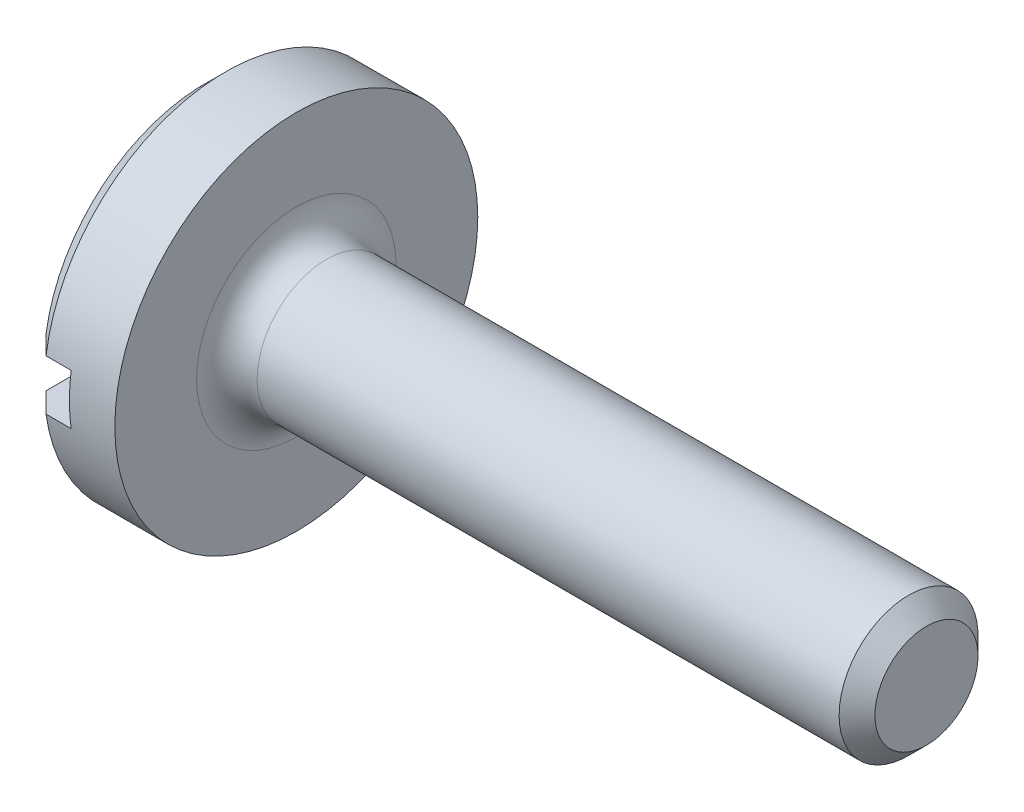
ISO-10303-21;
HEADER;
FILE_DESCRIPTION(('STEP AP214'),'2;1');
FILE_NAME('part.step','',(''),(''),'','','');
FILE_SCHEMA(('AUTOMOTIVE_DESIGN { 1 0 10303 214 1 1 1 1 }'));
ENDSEC;
DATA;
#1=APPLICATION_CONTEXT('core data for automotive mechanical design processes');
#2=APPLICATION_PROTOCOL_DEFINITION('international standard','automotive_design',2000,#1);
#3=PRODUCT_CONTEXT('',#1,'mechanical');
#4=PRODUCT('Part','Part','',(#3));
#5=PRODUCT_RELATED_PRODUCT_CATEGORY('part','',(#4));
#6=PRODUCT_DEFINITION_FORMATION('','',#4);
#7=PRODUCT_DEFINITION_CONTEXT('part definition',#1,'design');
#8=PRODUCT_DEFINITION('design','',#6,#7);
#9=PRODUCT_DEFINITION_SHAPE('','',#8);
#10=(LENGTH_UNIT() NAMED_UNIT(*) SI_UNIT(.MILLI.,.METRE.));
#11=(NAMED_UNIT(*) PLANE_ANGLE_UNIT() SI_UNIT($,.RADIAN.));
#12=(NAMED_UNIT(*) SI_UNIT($,.STERADIAN.) SOLID_ANGLE_UNIT());
#13=UNCERTAINTY_MEASURE_WITH_UNIT(LENGTH_MEASURE(1.E-05),#10,'distance_accuracy_value','');
#14=(GEOMETRIC_REPRESENTATION_CONTEXT(3) GLOBAL_UNCERTAINTY_ASSIGNED_CONTEXT((#13)) GLOBAL_UNIT_ASSIGNED_CONTEXT((#10,
#11,#12)) REPRESENTATION_CONTEXT('',''));
#15=CARTESIAN_POINT('',(0.,0.,0.));
#16=DIRECTION('',(0.,0.,1.));
#17=DIRECTION('',(1.,0.,0.));
#18=AXIS2_PLACEMENT_3D('',#15,#16,#17);
#19=CARTESIAN_POINT('',(-25.4,0.,0.));
#20=DIRECTION('',(-1.,0.,0.));
#21=DIRECTION('',(0.,0.,1.));
#22=AXIS2_PLACEMENT_3D('',#19,#20,#21);
#23=CYLINDRICAL_SURFACE('',#22,1.8288);
#24=CARTESIAN_POINT('',(0.914399999999999,0.,0.));
#25=DIRECTION('',(-1.,0.,0.));
#26=DIRECTION('',(0.,0.,1.));
#27=AXIS2_PLACEMENT_3D('',#24,#25,#26);
#28=CIRCLE('',#27,1.8288);
#29=CARTESIAN_POINT('',(0.914399999999999,0.,1.8288));
#30=VERTEX_POINT('',#29);
#31=EDGE_CURVE('E146',#30,#30,#28,.T.);
#32=ORIENTED_EDGE('',*,*,#31,.T.);
#33=EDGE_LOOP('',(#32));
#34=FACE_BOUND('',#33,.T.);
#35=CARTESIAN_POINT('',(0.203200000000001,0.,0.));
#36=DIRECTION('',(-1.,0.,0.));
#37=DIRECTION('',(0.,0.,1.));
#38=AXIS2_PLACEMENT_3D('',#35,#36,#37);
#39=CIRCLE('',#38,1.8288);
#40=CARTESIAN_POINT('',(0.20320000000003,-0.254,-1.81107521654959));
#41=VERTEX_POINT('',#40);
#42=CARTESIAN_POINT('',(0.203200000000001,-0.254,1.81107521654955));
#43=VERTEX_POINT('',#42);
#44=EDGE_CURVE('E147',#41,#43,#39,.T.);
#45=ORIENTED_EDGE('',*,*,#44,.F.);
#46=DIRECTION('',(-1.,0.,0.));
#47=VECTOR('',#46,1.);
#48=CARTESIAN_POINT('',(-25.4,-0.254,-1.81107521654955));
#49=LINE('',#48,#47);
#50=CARTESIAN_POINT('',(0.457200000000001,-0.254,-1.81107521654955));
#51=VERTEX_POINT('',#50);
#52=EDGE_CURVE('E55',#41,#51,#49,.F.);
#53=ORIENTED_EDGE('',*,*,#52,.T.);
#54=CARTESIAN_POINT('',(0.457200000000001,0.,0.));
#55=DIRECTION('',(-1.,0.,0.));
#56=DIRECTION('',(0.,0.,1.));
#57=AXIS2_PLACEMENT_3D('',#54,#55,#56);
#58=CIRCLE('',#57,1.8288);
#59=CARTESIAN_POINT('',(0.457200000000001,0.254,-1.81107521654955));
#60=VERTEX_POINT('',#59);
#61=EDGE_CURVE('E96',#51,#60,#58,.F.);
#62=ORIENTED_EDGE('',*,*,#61,.T.);
#63=DIRECTION('',(-1.,0.,0.));
#64=VECTOR('',#63,1.);
#65=CARTESIAN_POINT('',(-25.4,0.254,-1.81107521654955));
#66=LINE('',#65,#64);
#67=CARTESIAN_POINT('',(0.203200000000001,0.254,-1.81107521654955));
#68=VERTEX_POINT('',#67);
#69=EDGE_CURVE('E102',#60,#68,#66,.T.);
#70=ORIENTED_EDGE('',*,*,#69,.T.);
#71=CARTESIAN_POINT('',(0.20320000000003,0.254,1.81107521654959));
#72=VERTEX_POINT('',#71);
#73=EDGE_CURVE('E107',#72,#68,#39,.T.);
#74=ORIENTED_EDGE('',*,*,#73,.F.);
#75=DIRECTION('',(-1.,0.,0.));
#76=VECTOR('',#75,1.);
#77=CARTESIAN_POINT('',(-25.4,0.254,1.81107521654955));
#78=LINE('',#77,#76);
#79=CARTESIAN_POINT('',(0.457200000000001,0.254,1.81107521654955));
#80=VERTEX_POINT('',#79);
#81=EDGE_CURVE('E100',#72,#80,#78,.F.);
#82=ORIENTED_EDGE('',*,*,#81,.T.);
#83=CARTESIAN_POINT('',(0.457200000000001,-0.254,1.81107521654955));
#84=VERTEX_POINT('',#83);
#85=EDGE_CURVE('E86',#80,#84,#58,.F.);
#86=ORIENTED_EDGE('',*,*,#85,.T.);
#87=DIRECTION('',(-1.,0.,0.));
#88=VECTOR('',#87,1.);
#89=CARTESIAN_POINT('',(-25.4,-0.254,1.81107521654955));
#90=LINE('',#89,#88);
#91=EDGE_CURVE('E110',#84,#43,#90,.T.);
#92=ORIENTED_EDGE('',*,*,#91,.T.);
#93=EDGE_LOOP('',(#45,#53,#62,#70,#74,#82,#86,#92));
#94=FACE_BOUND('',#93,.T.);
#95=ADVANCED_FACE('F32',(#34,#94),#23,.T.);
#96=CARTESIAN_POINT('',(0.203200000000001,0.,0.));
#97=DIRECTION('',(1.,0.,0.));
#98=DIRECTION('',(0.,0.,-1.));
#99=AXIS2_PLACEMENT_3D('',#96,#97,#98);
#100=CONICAL_SURFACE('',#99,1.8288,0.785398163397453);
#101=CARTESIAN_POINT('',(2.40134405752285,-0.254,-4.01892553332588));
#102=CARTESIAN_POINT('',(2.26411243272227,-0.254,-3.88141790358882));
#103=CARTESIAN_POINT('',(2.12689277691977,-0.254,-3.74389831827494));
#104=CARTESIAN_POINT('',(1.85249047138508,-0.254,-3.46881754407069));
#105=CARTESIAN_POINT('',(1.71530782232552,-0.254,-3.33125635450939));
#106=CARTESIAN_POINT('',(1.44094420691617,-0.254,-3.05602612761354));
#107=CARTESIAN_POINT('',(1.303763261767,-0.254,-2.91835706914425));
#108=CARTESIAN_POINT('',(1.02948630576987,-0.254,-2.64293891043061));
#109=CARTESIAN_POINT('',(0.892390293544645,-0.254,-2.50518981155832));
#110=CARTESIAN_POINT('',(0.615134813964179,-0.254,-2.22634278737173));
#111=CARTESIAN_POINT('',(0.474978507385895,-0.254,-2.08524171972192));
#112=CARTESIAN_POINT('',(0.194901514559455,-0.254,-1.80279178606399));
#113=CARTESIAN_POINT('',(0.0549808402315515,-0.254,-1.66144290821658));
#114=CARTESIAN_POINT('',(-0.154496118844851,-0.254,-1.44905542487529));
#115=CARTESIAN_POINT('',(-0.22424585626257,-0.254,-1.37820765889293));
#116=CARTESIAN_POINT('',(-0.363542084541777,-0.254,-1.23630946617558));
#117=CARTESIAN_POINT('',(-0.433088571386075,-0.254,-1.16525903548911));
#118=CARTESIAN_POINT('',(-0.571828696059754,-0.254,-1.02282736930947));
#119=CARTESIAN_POINT('',(-0.641022365436821,-0.254,-0.951446164522407));
#120=CARTESIAN_POINT('',(-0.778783294995206,-0.254,-0.808082530297724));
#121=CARTESIAN_POINT('',(-0.847350581874042,-0.254,-0.736100126736938));
#122=CARTESIAN_POINT('',(-0.933516362099149,-0.254,-0.643824504174103));
#123=CARTESIAN_POINT('',(-0.951783104651057,-0.254,-0.624157019572037));
#124=CARTESIAN_POINT('',(-0.988170159206146,-0.254,-0.584687057869256));
#125=CARTESIAN_POINT('',(-1.00629046877054,-0.254,-0.56488457853034));
#126=CARTESIAN_POINT('',(-1.0603112755797,-0.254,-0.505296364236475));
#127=CARTESIAN_POINT('',(-1.09593883863702,-0.254,-0.465258446034815));
#128=CARTESIAN_POINT('',(-1.15457051293936,-0.254,-0.396927800211473));
#129=CARTESIAN_POINT('',(-1.17796824170313,-0.254,-0.368973254848941));
#130=CARTESIAN_POINT('',(-1.22365520952044,-0.254,-0.311993963952343));
#131=CARTESIAN_POINT('',(-1.24594060473571,-0.254,-0.282966039691323));
#132=CARTESIAN_POINT('',(-1.2848511746098,-0.254,-0.227850758463363));
#133=CARTESIAN_POINT('',(-1.30181803716944,-0.254,-0.20200616970696));
#134=CARTESIAN_POINT('',(-1.33229183899677,-0.254,-0.148331098872291));
#135=CARTESIAN_POINT('',(-1.34581753171551,-0.254,-0.120512485658227));
#136=CARTESIAN_POINT('',(-1.36086272842291,-0.254,-0.0759914441135061));
#137=CARTESIAN_POINT('',(-1.36503616799142,-0.254,-0.0602332670494036));
#138=CARTESIAN_POINT('',(-1.37051425854224,-0.254,-0.0282568335656514));
#139=CARTESIAN_POINT('',(-1.37183026519961,-0.254,-0.0120406587047759));
#140=CARTESIAN_POINT('',(-1.37130128833427,-0.254,0.020380248607248));
#141=CARTESIAN_POINT('',(-1.36944767179068,-0.254,0.0365848291615389));
#142=CARTESIAN_POINT('',(-1.36300429922283,-0.254,0.0684653426936683));
#143=CARTESIAN_POINT('',(-1.35840438631305,-0.254,0.0841390838798113));
#144=CARTESIAN_POINT('',(-1.34646501947902,-0.254,0.11690192886208));
#145=CARTESIAN_POINT('',(-1.33883071571793,-0.254,0.13387893617182));
#146=CARTESIAN_POINT('',(-1.32194163595541,-0.254,0.167021065627905));
#147=CARTESIAN_POINT('',(-1.31268339831085,-0.254,0.183184356543928));
#148=CARTESIAN_POINT('',(-1.29305944231903,-0.254,0.215000213341224));
#149=CARTESIAN_POINT('',(-1.28268509934841,-0.254,0.230647369139707));
#150=CARTESIAN_POINT('',(-1.26125731478647,-0.254,0.26143930714245));
#151=CARTESIAN_POINT('',(-1.25020459164877,-0.254,0.276584595541761));
#152=CARTESIAN_POINT('',(-1.21381853076418,-0.254,0.324861308288413));
#153=CARTESIAN_POINT('',(-1.18757520869,-0.254,0.357301673386364));
#154=CARTESIAN_POINT('',(-1.13398609835003,-0.254,0.421263730739061));
#155=CARTESIAN_POINT('',(-1.10663971527616,-0.254,0.452784911118691));
#156=CARTESIAN_POINT('',(-1.05126968718847,-0.254,0.51531649489643));
#157=CARTESIAN_POINT('',(-1.02324503054121,-0.254,0.546326002408838));
#158=CARTESIAN_POINT('',(-0.966812178882557,-0.254,0.607977744293632));
#159=CARTESIAN_POINT('',(-0.938404079735878,-0.254,0.638620066977673));
#160=CARTESIAN_POINT('',(-0.853090166985993,-0.254,0.72988285223681));
#161=CARTESIAN_POINT('',(-0.795810543893227,-0.254,0.790153391373873));
#162=CARTESIAN_POINT('',(-0.680808151853422,-0.254,0.910162705667788));
#163=CARTESIAN_POINT('',(-0.623085829918423,-0.254,0.969901911974569));
#164=CARTESIAN_POINT('',(-0.443292149005697,-0.254,1.15510727368889));
#165=CARTESIAN_POINT('',(-0.320740378684249,-0.254,1.28010671404794));
#166=CARTESIAN_POINT('',(-0.0751604759332185,-0.254,1.52963868537837));
#167=CARTESIAN_POINT('',(0.0478676650915984,-0.254,1.65417120784451));
#168=CARTESIAN_POINT('',(0.294233743694415,-0.254,1.90303992156951));
#169=CARTESIAN_POINT('',(0.417571795131782,-0.254,2.02737600024342));
#170=CARTESIAN_POINT('',(0.664390076550216,-0.254,2.27590505103912));
#171=CARTESIAN_POINT('',(0.787870305533691,-0.254,2.40009802415292));
#172=CARTESIAN_POINT('',(1.15954500163206,-0.254,2.77365393576745));
#173=CARTESIAN_POINT('',(1.40787267384457,-0.254000000000001,3.02288435122639));
#174=CARTESIAN_POINT('',(1.78042320401371,-0.254000000000001,3.39655135583526));
#175=CARTESIAN_POINT('',(1.90458661719065,-0.254000000000001,3.52104726889028));
#176=CARTESIAN_POINT('',(2.15294426029162,-0.254000000000001,3.77000773292231));
#177=CARTESIAN_POINT('',(2.27713849013786,-0.254000000000001,3.89447228397693));
#178=CARTESIAN_POINT('',(2.40134405752285,-0.254000000000001,4.01892553332588));
#179=B_SPLINE_CURVE_WITH_KNOTS('',3,(#101,#102,#103,#104,#105,#106,#107,#108,#109,#110,#111,
#112,#113,#114,#115,#116,#117,#118,#119,#120,#121,#122,#123,#124,#125,#126,#127,#128,#129,#130,
#131,#132,#133,#134,#135,#136,#137,#138,#139,#140,#141,#142,#143,#144,#145,#146,#147,#148,#149,
#150,#151,#152,#153,#154,#155,#156,#157,#158,#159,#160,#161,#162,#163,#164,#165,#166,#167,#168,
#169,#170,#171,#172,#173,#174,#175,#176,#177,#178),.UNSPECIFIED.,.F.,.F.,(4,2,2,2,2,2,2,2,2,2,2,
2,2,2,2,2,2,2,2,2,2,2,2,2,2,2,2,2,2,2,2,2,2,2,2,2,2,2,4),(0.,0.58281027527497,1.16563051233696,
1.74867632085366,2.33171241342823,2.92835272249034,3.52502235865943,3.82328364920685,
4.12155079546634,4.41979078684131,4.71801800683685,4.79854261597235,4.87906856346162,
5.03982632551315,5.1491791522158,5.25888686445592,5.35156888904403,5.44373444598671,
5.49243715213885,5.54094595272456,5.58958708602226,5.63840923755168,5.69411617300797,
5.7499433316352,5.80623797536793,5.8624739947275,5.98758936383189,6.1127731257549,
6.23815676171011,6.3635096106225,6.61294438570957,6.86215385501982,7.38730971657339,
7.91247509817027,8.43787512998004,8.96327149750594,10.0187530601156,10.5462396255113,
11.0737248727092),.UNSPECIFIED.);
#180=CARTESIAN_POINT('',(0.,-0.254,-1.60563363193475));
#181=VERTEX_POINT('',#180);
#182=EDGE_CURVE('E112',#41,#181,#179,.T.);
#183=ORIENTED_EDGE('',*,*,#182,.F.);
#184=ORIENTED_EDGE('',*,*,#44,.T.);
#185=CARTESIAN_POINT('',(0.,-0.254,1.60563363193475));
#186=VERTEX_POINT('',#185);
#187=EDGE_CURVE('E108',#186,#43,#179,.T.);
#188=ORIENTED_EDGE('',*,*,#187,.F.);
#189=CARTESIAN_POINT('',(0.,0.,0.));
#190=DIRECTION('',(-1.,0.,0.));
#191=DIRECTION('',(0.,0.,1.));
#192=AXIS2_PLACEMENT_3D('',#189,#190,#191);
#193=CIRCLE('',#192,1.6256);
#194=EDGE_CURVE('E197',#181,#186,#193,.T.);
#195=ORIENTED_EDGE('',*,*,#194,.F.);
#196=EDGE_LOOP('',(#183,#184,#188,#195));
#197=FACE_BOUND('',#196,.T.);
#198=ADVANCED_FACE('F123',(#197),#100,.T.);
#199=CARTESIAN_POINT('',(2.40134405752285,0.254,4.01892553332588));
#200=CARTESIAN_POINT('',(2.26411243272227,0.254,3.88141790358882));
#201=CARTESIAN_POINT('',(2.12689277691977,0.254,3.74389831827494));
#202=CARTESIAN_POINT('',(1.85249047138508,0.254,3.46881754407069));
#203=CARTESIAN_POINT('',(1.71530782232552,0.254,3.33125635450939));
#204=CARTESIAN_POINT('',(1.44094420691617,0.254,3.05602612761354));
#205=CARTESIAN_POINT('',(1.303763261767,0.254,2.91835706914425));
#206=CARTESIAN_POINT('',(1.02948630576987,0.254,2.64293891043062));
#207=CARTESIAN_POINT('',(0.892390293544648,0.254,2.50518981155833));
#208=CARTESIAN_POINT('',(0.615134813964182,0.254,2.22634278737174));
#209=CARTESIAN_POINT('',(0.474978507385898,0.254,2.08524171972192));
#210=CARTESIAN_POINT('',(0.194901514559457,0.254,1.802791786064));
#211=CARTESIAN_POINT('',(0.0549808402315534,0.254,1.66144290821658));
#212=CARTESIAN_POINT('',(-0.154496118844849,0.254,1.44905542487529));
#213=CARTESIAN_POINT('',(-0.224245856262568,0.254,1.37820765889293));
#214=CARTESIAN_POINT('',(-0.363542084541775,0.254,1.23630946617558));
#215=CARTESIAN_POINT('',(-0.433088571386074,0.254,1.16525903548911));
#216=CARTESIAN_POINT('',(-0.571828696059752,0.254,1.02282736930947));
#217=CARTESIAN_POINT('',(-0.641022365436819,0.254,0.951446164522408));
#218=CARTESIAN_POINT('',(-0.778783294995205,0.254,0.808082530297725));
#219=CARTESIAN_POINT('',(-0.847350581874042,0.254,0.73610012673694));
#220=CARTESIAN_POINT('',(-0.933516362099149,0.254,0.643824504174104));
#221=CARTESIAN_POINT('',(-0.951783104651056,0.254,0.624157019572038));
#222=CARTESIAN_POINT('',(-0.988170159206145,0.254,0.584687057869257));
#223=CARTESIAN_POINT('',(-1.00629046877054,0.254,0.564884578530342));
#224=CARTESIAN_POINT('',(-1.0603112755797,0.254,0.505296364236476));
#225=CARTESIAN_POINT('',(-1.09593883863702,0.254,0.465258446034816));
#226=CARTESIAN_POINT('',(-1.15457051293936,0.254,0.396927800211474));
#227=CARTESIAN_POINT('',(-1.17796824170313,0.254,0.368973254848942));
#228=CARTESIAN_POINT('',(-1.22365520952044,0.254,0.311993963952344));
#229=CARTESIAN_POINT('',(-1.24594060473571,0.254,0.282966039691324));
#230=CARTESIAN_POINT('',(-1.2848511746098,0.254,0.227850758463364));
#231=CARTESIAN_POINT('',(-1.30181803716944,0.254,0.202006169706961));
#232=CARTESIAN_POINT('',(-1.33229183899677,0.254,0.148331098872291));
#233=CARTESIAN_POINT('',(-1.34581753171551,0.254,0.120512485658227));
#234=CARTESIAN_POINT('',(-1.36086272842291,0.254,0.0759914441135048));
#235=CARTESIAN_POINT('',(-1.36503616799142,0.254,0.0602332670494021));
#236=CARTESIAN_POINT('',(-1.37051425854224,0.254,0.0282568335656497));
#237=CARTESIAN_POINT('',(-1.37183026519961,0.254,0.0120406587047744));
#238=CARTESIAN_POINT('',(-1.37130128833427,0.254,-0.0203802486072495));
#239=CARTESIAN_POINT('',(-1.36944767179068,0.254,-0.0365848291615405));
#240=CARTESIAN_POINT('',(-1.36300429922283,0.254,-0.0684653426936699));
#241=CARTESIAN_POINT('',(-1.35840438631305,0.254,-0.084139083879813));
#242=CARTESIAN_POINT('',(-1.34646501947902,0.254,-0.116901928862082));
#243=CARTESIAN_POINT('',(-1.33883071571793,0.254,-0.133878936171822));
#244=CARTESIAN_POINT('',(-1.32194163595541,0.254,-0.167021065627908));
#245=CARTESIAN_POINT('',(-1.31268339831085,0.254,-0.183184356543931));
#246=CARTESIAN_POINT('',(-1.29305944231903,0.254,-0.215000213341228));
#247=CARTESIAN_POINT('',(-1.2826850993484,0.254,-0.230647369139711));
#248=CARTESIAN_POINT('',(-1.26125731478647,0.254,-0.261439307142454));
#249=CARTESIAN_POINT('',(-1.25020459164876,0.254,-0.276584595541766));
#250=CARTESIAN_POINT('',(-1.21381853076418,0.254,-0.324861308288419));
#251=CARTESIAN_POINT('',(-1.18757520868999,0.254,-0.35730167338637));
#252=CARTESIAN_POINT('',(-1.13398609835003,0.254,-0.421263730739069));
#253=CARTESIAN_POINT('',(-1.10663971527615,0.254,-0.452784911118699));
#254=CARTESIAN_POINT('',(-1.05126968718847,0.254,-0.51531649489644));
#255=CARTESIAN_POINT('',(-1.0232450305412,0.254,-0.546326002408848));
#256=CARTESIAN_POINT('',(-0.966812178882546,0.254,-0.607977744293644));
#257=CARTESIAN_POINT('',(-0.938404079735866,0.254,-0.638620066977685));
#258=CARTESIAN_POINT('',(-0.853090166985979,0.254,-0.729882852236825));
#259=CARTESIAN_POINT('',(-0.795810543893212,0.254,-0.790153391373889));
#260=CARTESIAN_POINT('',(-0.680808151853404,0.254,-0.910162705667807));
#261=CARTESIAN_POINT('',(-0.623085829918403,0.254,-0.96990191197459));
#262=CARTESIAN_POINT('',(-0.443292149005677,0.254,-1.15510727368891));
#263=CARTESIAN_POINT('',(-0.32074037868423,0.254,-1.28010671404796));
#264=CARTESIAN_POINT('',(-0.0751604759332015,0.254,-1.52963868537839));
#265=CARTESIAN_POINT('',(0.0478676650916143,0.254,-1.65417120784453));
#266=CARTESIAN_POINT('',(0.294233743694429,0.254,-1.90303992156952));
#267=CARTESIAN_POINT('',(0.417571795131795,0.254,-2.02737600024343));
#268=CARTESIAN_POINT('',(0.664390076550226,0.254,-2.27590505103913));
#269=CARTESIAN_POINT('',(0.7878703055337,0.254,-2.40009802415293));
#270=CARTESIAN_POINT('',(1.15954500163207,0.254,-2.77365393576746));
#271=CARTESIAN_POINT('',(1.40787267384457,0.254,-3.0228843512264));
#272=CARTESIAN_POINT('',(1.78042320401372,0.254,-3.39655135583526));
#273=CARTESIAN_POINT('',(1.90458661719066,0.254,-3.52104726889028));
#274=CARTESIAN_POINT('',(2.15294426029162,0.254,-3.77000773292232));
#275=CARTESIAN_POINT('',(2.27713849013787,0.254,-3.89447228397693));
#276=CARTESIAN_POINT('',(2.40134405752285,0.254,-4.01892553332588));
#277=B_SPLINE_CURVE_WITH_KNOTS('',3,(#199,#200,#201,#202,#203,#204,#205,#206,#207,#208,#209,
#210,#211,#212,#213,#214,#215,#216,#217,#218,#219,#220,#221,#222,#223,#224,#225,#226,#227,#228,
#229,#230,#231,#232,#233,#234,#235,#236,#237,#238,#239,#240,#241,#242,#243,#244,#245,#246,#247,
#248,#249,#250,#251,#252,#253,#254,#255,#256,#257,#258,#259,#260,#261,#262,#263,#264,#265,#266,
#267,#268,#269,#270,#271,#272,#273,#274,#275,#276),.UNSPECIFIED.,.F.,.F.,(4,2,2,2,2,2,2,2,2,2,2,
2,2,2,2,2,2,2,2,2,2,2,2,2,2,2,2,2,2,2,2,2,2,2,2,2,2,2,4),(0.,0.582810275274969,1.16563051233696,
1.74867632085366,2.33171241342823,2.92835272249034,3.52502235865943,3.82328364920685,
4.12155079546634,4.41979078684131,4.71801800683685,4.79854261597235,4.87906856346162,
5.03982632551315,5.1491791522158,5.25888686445592,5.35156888904403,5.44373444598671,
5.49243715213886,5.54094595272457,5.58958708602226,5.63840923755168,5.69411617300797,
5.74994333163521,5.80623797536793,5.8624739947275,5.9875893638319,6.11277312575492,
6.23815676171012,6.36350961062252,6.6129443857096,6.86215385501985,7.38730971657341,
7.9124750981703,8.43787512998006,8.96327149750596,10.0187530601156,10.5462396255113,
11.0737248727092),.UNSPECIFIED.);
#278=CARTESIAN_POINT('',(0.,0.254,1.60563363193475));
#279=VERTEX_POINT('',#278);
#280=EDGE_CURVE('E47',#72,#279,#277,.T.);
#281=ORIENTED_EDGE('',*,*,#280,.F.);
#282=ORIENTED_EDGE('',*,*,#73,.T.);
#283=CARTESIAN_POINT('',(0.,0.254,-1.60563363193475));
#284=VERTEX_POINT('',#283);
#285=EDGE_CURVE('E114',#284,#68,#277,.T.);
#286=ORIENTED_EDGE('',*,*,#285,.F.);
#287=EDGE_CURVE('E153',#279,#284,#193,.T.);
#288=ORIENTED_EDGE('',*,*,#287,.F.);
#289=EDGE_LOOP('',(#281,#282,#286,#288));
#290=FACE_BOUND('',#289,.T.);
#291=ADVANCED_FACE('F143',(#290),#100,.T.);
#292=CARTESIAN_POINT('',(0.,0.,0.));
#293=DIRECTION('',(-1.,0.,0.));
#294=DIRECTION('',(0.,0.,1.));
#295=AXIS2_PLACEMENT_3D('',#292,#293,#294);
#296=PLANE('',#295);
#297=ORIENTED_EDGE('',*,*,#194,.T.);
#298=DIRECTION('',(0.,0.,-1.));
#299=VECTOR('',#298,1.);
#300=CARTESIAN_POINT('',(0.,-0.254,0.));
#301=LINE('',#300,#299);
#302=EDGE_CURVE('E97',#186,#181,#301,.T.);
#303=ORIENTED_EDGE('',*,*,#302,.T.);
#304=EDGE_LOOP('',(#297,#303));
#305=FACE_BOUND('',#304,.T.);
#306=ADVANCED_FACE('F187',(#305),#296,.T.);
#307=ORIENTED_EDGE('',*,*,#287,.T.);
#308=DIRECTION('',(0.,0.,1.));
#309=VECTOR('',#308,1.);
#310=CARTESIAN_POINT('',(0.,0.254,0.));
#311=LINE('',#310,#309);
#312=EDGE_CURVE('E150',#284,#279,#311,.T.);
#313=ORIENTED_EDGE('',*,*,#312,.T.);
#314=EDGE_LOOP('',(#307,#313));
#315=FACE_BOUND('',#314,.T.);
#316=ADVANCED_FACE('F182',(#315),#296,.T.);
#317=CARTESIAN_POINT('',(-25.4,0.,0.));
#318=DIRECTION('',(-1.,0.,0.));
#319=DIRECTION('',(0.,0.,1.));
#320=AXIS2_PLACEMENT_3D('',#317,#318,#319);
#321=CYLINDRICAL_SURFACE('',#320,0.69977);
#322=CARTESIAN_POINT('',(1.2192,0.,0.));
#323=DIRECTION('',(-1.,0.,0.));
#324=DIRECTION('',(0.,0.,1.));
#325=AXIS2_PLACEMENT_3D('',#322,#323,#324);
#326=CIRCLE('',#325,0.69977);
#327=CARTESIAN_POINT('',(1.2192,0.,0.69977));
#328=VERTEX_POINT('',#327);
#329=EDGE_CURVE('E11',#328,#328,#326,.F.);
#330=ORIENTED_EDGE('',*,*,#329,.T.);
#331=EDGE_LOOP('',(#330));
#332=FACE_BOUND('',#331,.T.);
#333=CARTESIAN_POINT('',(7.08406,0.,0.));
#334=DIRECTION('',(-1.,0.,0.));
#335=DIRECTION('',(0.,0.,1.));
#336=AXIS2_PLACEMENT_3D('',#333,#334,#335);
#337=CIRCLE('',#336,0.69977);
#338=CARTESIAN_POINT('',(7.08406,0.,0.69977));
#339=VERTEX_POINT('',#338);
#340=EDGE_CURVE('E192',#339,#339,#337,.T.);
#341=ORIENTED_EDGE('',*,*,#340,.T.);
#342=EDGE_LOOP('',(#341));
#343=FACE_BOUND('',#342,.T.);
#344=ADVANCED_FACE('F180',(#332,#343),#321,.T.);
#345=CARTESIAN_POINT('',(0.9144,0.69977,0.));
#346=DIRECTION('',(-1.,0.,0.));
#347=DIRECTION('',(0.,0.,1.));
#348=AXIS2_PLACEMENT_3D('',#345,#346,#347);
#349=PLANE('',#348);
#350=CARTESIAN_POINT('',(0.9144,0.,0.));
#351=DIRECTION('',(-1.,0.,0.));
#352=DIRECTION('',(0.,0.,1.));
#353=AXIS2_PLACEMENT_3D('',#350,#351,#352);
#354=CIRCLE('',#353,1.00457);
#355=CARTESIAN_POINT('',(0.9144,0.,1.00457));
#356=VERTEX_POINT('',#355);
#357=EDGE_CURVE('E40',#356,#356,#354,.T.);
#358=ORIENTED_EDGE('',*,*,#357,.T.);
#359=EDGE_LOOP('',(#358));
#360=FACE_BOUND('',#359,.T.);
#361=ORIENTED_EDGE('',*,*,#31,.F.);
#362=EDGE_LOOP('',(#361));
#363=FACE_BOUND('',#362,.T.);
#364=ADVANCED_FACE('F162',(#360,#363),#349,.F.);
#365=CARTESIAN_POINT('',(7.2644,0.51943,0.));
#366=DIRECTION('',(1.,0.,0.));
#367=DIRECTION('',(0.,0.,-1.));
#368=AXIS2_PLACEMENT_3D('',#365,#366,#367);
#369=PLANE('',#368);
#370=CARTESIAN_POINT('',(7.2644,0.,0.));
#371=DIRECTION('',(-1.,0.,0.));
#372=DIRECTION('',(0.,0.,1.));
#373=AXIS2_PLACEMENT_3D('',#370,#371,#372);
#374=CIRCLE('',#373,0.51943);
#375=CARTESIAN_POINT('',(7.2644,0.,0.51943));
#376=VERTEX_POINT('',#375);
#377=EDGE_CURVE('E194',#376,#376,#374,.T.);
#378=ORIENTED_EDGE('',*,*,#377,.F.);
#379=EDGE_LOOP('',(#378));
#380=FACE_BOUND('',#379,.T.);
#381=ADVANCED_FACE('F179',(#380),#369,.T.);
#382=CARTESIAN_POINT('',(7.08406,0.,0.));
#383=DIRECTION('',(-1.,0.,0.));
#384=DIRECTION('',(0.,0.,1.));
#385=AXIS2_PLACEMENT_3D('',#382,#383,#384);
#386=CONICAL_SURFACE('',#385,0.69977,0.785398163397446);
#387=ORIENTED_EDGE('',*,*,#377,.T.);
#388=EDGE_LOOP('',(#387));
#389=FACE_BOUND('',#388,.T.);
#390=ORIENTED_EDGE('',*,*,#340,.F.);
#391=EDGE_LOOP('',(#390));
#392=FACE_BOUND('',#391,.T.);
#393=ADVANCED_FACE('F132',(#389,#392),#386,.T.);
#394=CARTESIAN_POINT('',(0.,-0.254,-1.8288));
#395=DIRECTION('',(0.,1.,0.));
#396=DIRECTION('',(0.,0.,1.));
#397=AXIS2_PLACEMENT_3D('',#394,#395,#396);
#398=PLANE('',#397);
#399=ORIENTED_EDGE('',*,*,#182,.T.);
#400=ORIENTED_EDGE('',*,*,#302,.F.);
#401=ORIENTED_EDGE('',*,*,#187,.T.);
#402=ORIENTED_EDGE('',*,*,#91,.F.);
#403=DIRECTION('',(0.,0.,1.));
#404=VECTOR('',#403,1.);
#405=CARTESIAN_POINT('',(0.4572,-0.254,-1.8288));
#406=LINE('',#405,#404);
#407=EDGE_CURVE('E91',#51,#84,#406,.T.);
#408=ORIENTED_EDGE('',*,*,#407,.F.);
#409=ORIENTED_EDGE('',*,*,#52,.F.);
#410=EDGE_LOOP('',(#399,#400,#401,#402,#408,#409));
#411=FACE_BOUND('',#410,.T.);
#412=ADVANCED_FACE('F127',(#411),#398,.T.);
#413=CARTESIAN_POINT('',(0.,0.254,1.8288));
#414=DIRECTION('',(0.,-1.,0.));
#415=DIRECTION('',(0.,0.,-1.));
#416=AXIS2_PLACEMENT_3D('',#413,#414,#415);
#417=PLANE('',#416);
#418=ORIENTED_EDGE('',*,*,#280,.T.);
#419=ORIENTED_EDGE('',*,*,#312,.F.);
#420=ORIENTED_EDGE('',*,*,#285,.T.);
#421=ORIENTED_EDGE('',*,*,#69,.F.);
#422=DIRECTION('',(0.,0.,-1.));
#423=VECTOR('',#422,1.);
#424=CARTESIAN_POINT('',(0.4572,0.254,1.8288));
#425=LINE('',#424,#423);
#426=EDGE_CURVE('E89',#80,#60,#425,.T.);
#427=ORIENTED_EDGE('',*,*,#426,.F.);
#428=ORIENTED_EDGE('',*,*,#81,.F.);
#429=EDGE_LOOP('',(#418,#419,#420,#421,#427,#428));
#430=FACE_BOUND('',#429,.T.);
#431=ADVANCED_FACE('F99',(#430),#417,.T.);
#432=CARTESIAN_POINT('',(0.4572,0.254,-1.8288));
#433=DIRECTION('',(-1.,0.,0.));
#434=DIRECTION('',(0.,0.,1.));
#435=AXIS2_PLACEMENT_3D('',#432,#433,#434);
#436=PLANE('',#435);
#437=ORIENTED_EDGE('',*,*,#407,.T.);
#438=ORIENTED_EDGE('',*,*,#85,.F.);
#439=ORIENTED_EDGE('',*,*,#426,.T.);
#440=ORIENTED_EDGE('',*,*,#61,.F.);
#441=EDGE_LOOP('',(#437,#438,#439,#440));
#442=FACE_BOUND('',#441,.T.);
#443=ADVANCED_FACE('F88',(#442),#436,.T.);
#444=CARTESIAN_POINT('',(1.2192,0.,0.));
#445=DIRECTION('',(-1.,0.,0.));
#446=DIRECTION('',(0.,0.,1.));
#447=AXIS2_PLACEMENT_3D('',#444,#445,#446);
#448=TOROIDAL_SURFACE('',#447,1.00457,0.3048);
#449=ORIENTED_EDGE('',*,*,#329,.F.);
#450=EDGE_LOOP('',(#449));
#451=FACE_BOUND('',#450,.T.);
#452=ORIENTED_EDGE('',*,*,#357,.F.);
#453=EDGE_LOOP('',(#452));
#454=FACE_BOUND('',#453,.T.);
#455=ADVANCED_FACE('F34',(#451,#454),#448,.F.);
#456=CLOSED_SHELL('',(#95,#198,#291,#306,#316,#344,#364,#381,#393,#412,#431,#443,#455));
#457=MANIFOLD_SOLID_BREP('B2',#456);
#458=ADVANCED_BREP_SHAPE_REPRESENTATION('',(#18,#457),#14);
#459=SHAPE_DEFINITION_REPRESENTATION(#9,#458);
ENDSEC;
END-ISO-10303-21;
